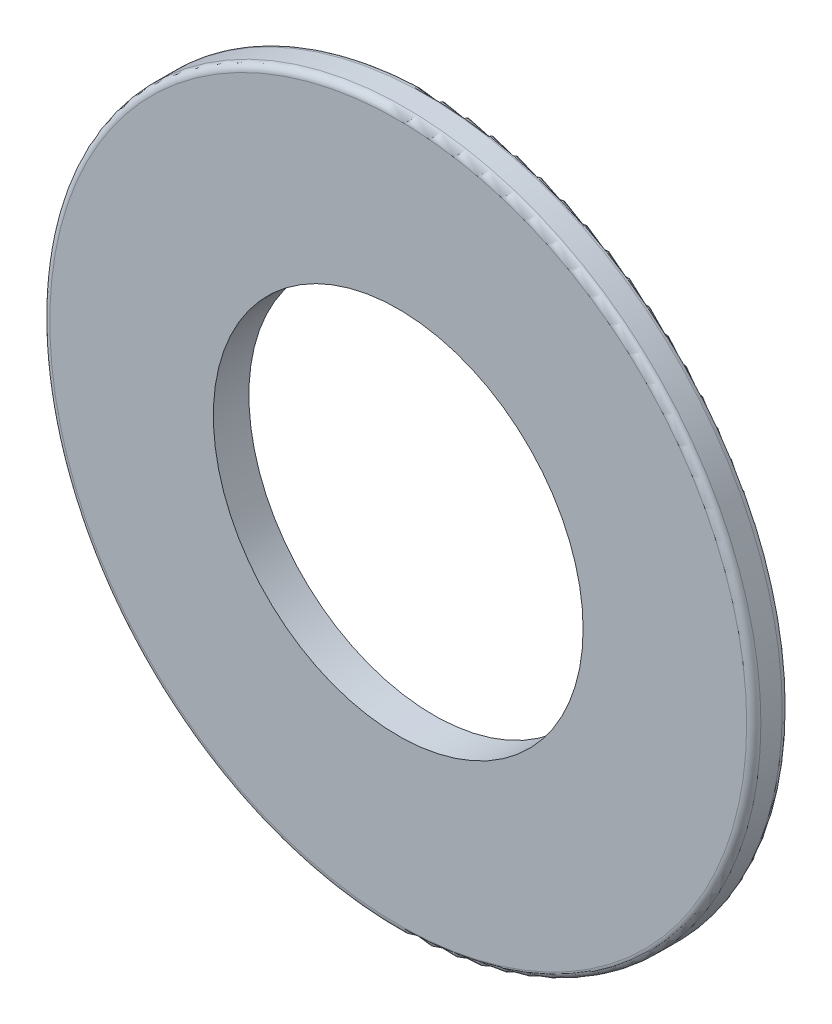
ISO-10303-21;
HEADER;
FILE_DESCRIPTION(('STEP AP214'),'2;1');
FILE_NAME('part.step','',(''),(''),'','','');
FILE_SCHEMA(('AUTOMOTIVE_DESIGN { 1 0 10303 214 1 1 1 1 }'));
ENDSEC;
DATA;
#1=APPLICATION_CONTEXT('core data for automotive mechanical design processes');
#2=APPLICATION_PROTOCOL_DEFINITION('international standard','automotive_design',2000,#1);
#3=PRODUCT_CONTEXT('',#1,'mechanical');
#4=PRODUCT('Part','Part','',(#3));
#5=PRODUCT_RELATED_PRODUCT_CATEGORY('part','',(#4));
#6=PRODUCT_DEFINITION_FORMATION('','',#4);
#7=PRODUCT_DEFINITION_CONTEXT('part definition',#1,'design');
#8=PRODUCT_DEFINITION('design','',#6,#7);
#9=PRODUCT_DEFINITION_SHAPE('','',#8);
#10=(LENGTH_UNIT() NAMED_UNIT(*) SI_UNIT(.MILLI.,.METRE.));
#11=(NAMED_UNIT(*) PLANE_ANGLE_UNIT() SI_UNIT($,.RADIAN.));
#12=(NAMED_UNIT(*) SI_UNIT($,.STERADIAN.) SOLID_ANGLE_UNIT());
#13=UNCERTAINTY_MEASURE_WITH_UNIT(LENGTH_MEASURE(1.E-05),#10,'distance_accuracy_value','');
#14=(GEOMETRIC_REPRESENTATION_CONTEXT(3) GLOBAL_UNCERTAINTY_ASSIGNED_CONTEXT((#13)) GLOBAL_UNIT_ASSIGNED_CONTEXT((#10,
#11,#12)) REPRESENTATION_CONTEXT('',''));
#15=CARTESIAN_POINT('',(0.,0.,0.));
#16=DIRECTION('',(0.,0.,1.));
#17=DIRECTION('',(1.,0.,0.));
#18=AXIS2_PLACEMENT_3D('',#15,#16,#17);
#19=CARTESIAN_POINT('',(0.,0.,0.5));
#20=DIRECTION('',(0.,0.,1.));
#21=DIRECTION('',(1.,0.,0.));
#22=AXIS2_PLACEMENT_3D('',#19,#20,#21);
#23=PLANE('',#22);
#24=CARTESIAN_POINT('',(0.,0.,0.5));
#25=DIRECTION('',(0.,0.,1.));
#26=DIRECTION('',(1.,0.,0.));
#27=AXIS2_PLACEMENT_3D('',#24,#25,#26);
#28=CIRCLE('',#27,4.9);
#29=CARTESIAN_POINT('',(4.9,0.,0.5));
#30=VERTEX_POINT('',#29);
#31=EDGE_CURVE('E10',#30,#30,#28,.T.);
#32=ORIENTED_EDGE('',*,*,#31,.T.);
#33=EDGE_LOOP('',(#32));
#34=FACE_BOUND('',#33,.T.);
#35=CARTESIAN_POINT('',(0.,0.,0.5));
#36=DIRECTION('',(0.,0.,1.));
#37=DIRECTION('',(1.,0.,0.));
#38=AXIS2_PLACEMENT_3D('',#35,#36,#37);
#39=CIRCLE('',#38,2.6);
#40=CARTESIAN_POINT('',(2.6,0.,0.5));
#41=VERTEX_POINT('',#40);
#42=EDGE_CURVE('E65',#41,#41,#39,.T.);
#43=ORIENTED_EDGE('',*,*,#42,.F.);
#44=EDGE_LOOP('',(#43));
#45=FACE_BOUND('',#44,.T.);
#46=ADVANCED_FACE('F41',(#34,#45),#23,.T.);
#47=CARTESIAN_POINT('',(0.,0.,0.));
#48=DIRECTION('',(0.,0.,1.));
#49=DIRECTION('',(1.,0.,0.));
#50=AXIS2_PLACEMENT_3D('',#47,#48,#49);
#51=PLANE('',#50);
#52=CARTESIAN_POINT('',(0.,0.,0.));
#53=DIRECTION('',(0.,0.,1.));
#54=DIRECTION('',(1.,0.,0.));
#55=AXIS2_PLACEMENT_3D('',#52,#53,#54);
#56=CIRCLE('',#55,4.9);
#57=CARTESIAN_POINT('',(4.9,0.,0.));
#58=VERTEX_POINT('',#57);
#59=EDGE_CURVE('E49',#58,#58,#56,.F.);
#60=ORIENTED_EDGE('',*,*,#59,.T.);
#61=EDGE_LOOP('',(#60));
#62=FACE_BOUND('',#61,.T.);
#63=CARTESIAN_POINT('',(0.,0.,0.));
#64=DIRECTION('',(0.,0.,1.));
#65=DIRECTION('',(1.,0.,0.));
#66=AXIS2_PLACEMENT_3D('',#63,#64,#65);
#67=CIRCLE('',#66,2.6);
#68=CARTESIAN_POINT('',(2.6,0.,0.));
#69=VERTEX_POINT('',#68);
#70=EDGE_CURVE('E66',#69,#69,#67,.T.);
#71=ORIENTED_EDGE('',*,*,#70,.T.);
#72=EDGE_LOOP('',(#71));
#73=FACE_BOUND('',#72,.T.);
#74=ADVANCED_FACE('F78',(#62,#73),#51,.F.);
#75=CARTESIAN_POINT('',(0.,0.,0.5));
#76=DIRECTION('',(0.,0.,-1.));
#77=DIRECTION('',(-1.,0.,0.));
#78=AXIS2_PLACEMENT_3D('',#75,#76,#77);
#79=CYLINDRICAL_SURFACE('',#78,5.);
#80=CARTESIAN_POINT('',(0.,0.,0.1));
#81=DIRECTION('',(0.,0.,1.));
#82=DIRECTION('',(1.,0.,0.));
#83=AXIS2_PLACEMENT_3D('',#80,#81,#82);
#84=CIRCLE('',#83,5.);
#85=CARTESIAN_POINT('',(5.,0.,0.1));
#86=VERTEX_POINT('',#85);
#87=EDGE_CURVE('E54',#86,#86,#84,.T.);
#88=ORIENTED_EDGE('',*,*,#87,.T.);
#89=EDGE_LOOP('',(#88));
#90=FACE_BOUND('',#89,.T.);
#91=CARTESIAN_POINT('',(0.,0.,0.4));
#92=DIRECTION('',(0.,0.,1.));
#93=DIRECTION('',(1.,0.,0.));
#94=AXIS2_PLACEMENT_3D('',#91,#92,#93);
#95=CIRCLE('',#94,5.);
#96=CARTESIAN_POINT('',(5.,0.,0.4));
#97=VERTEX_POINT('',#96);
#98=EDGE_CURVE('E59',#97,#97,#95,.F.);
#99=ORIENTED_EDGE('',*,*,#98,.T.);
#100=EDGE_LOOP('',(#99));
#101=FACE_BOUND('',#100,.T.);
#102=ADVANCED_FACE('F83',(#90,#101),#79,.T.);
#103=CARTESIAN_POINT('',(0.,0.,0.5));
#104=DIRECTION('',(0.,0.,-1.));
#105=DIRECTION('',(-1.,0.,0.));
#106=AXIS2_PLACEMENT_3D('',#103,#104,#105);
#107=CYLINDRICAL_SURFACE('',#106,2.6);
#108=ORIENTED_EDGE('',*,*,#42,.T.);
#109=EDGE_LOOP('',(#108));
#110=FACE_BOUND('',#109,.T.);
#111=ORIENTED_EDGE('',*,*,#70,.F.);
#112=EDGE_LOOP('',(#111));
#113=FACE_BOUND('',#112,.T.);
#114=ADVANCED_FACE('F74',(#110,#113),#107,.F.);
#115=CARTESIAN_POINT('',(0.,0.,0.1));
#116=DIRECTION('',(0.,0.,1.));
#117=DIRECTION('',(1.,0.,0.));
#118=AXIS2_PLACEMENT_3D('',#115,#116,#117);
#119=TOROIDAL_SURFACE('',#118,4.9,0.1);
#120=ORIENTED_EDGE('',*,*,#59,.F.);
#121=EDGE_LOOP('',(#120));
#122=FACE_BOUND('',#121,.T.);
#123=ORIENTED_EDGE('',*,*,#87,.F.);
#124=EDGE_LOOP('',(#123));
#125=FACE_BOUND('',#124,.T.);
#126=ADVANCED_FACE('F89',(#122,#125),#119,.T.);
#127=CARTESIAN_POINT('',(0.,0.,0.4));
#128=DIRECTION('',(0.,0.,1.));
#129=DIRECTION('',(1.,0.,0.));
#130=AXIS2_PLACEMENT_3D('',#127,#128,#129);
#131=TOROIDAL_SURFACE('',#130,4.9,0.1);
#132=ORIENTED_EDGE('',*,*,#98,.F.);
#133=EDGE_LOOP('',(#132));
#134=FACE_BOUND('',#133,.T.);
#135=ORIENTED_EDGE('',*,*,#31,.F.);
#136=EDGE_LOOP('',(#135));
#137=FACE_BOUND('',#136,.T.);
#138=ADVANCED_FACE('F43',(#134,#137),#131,.T.);
#139=CLOSED_SHELL('',(#46,#74,#102,#114,#126,#138));
#140=MANIFOLD_SOLID_BREP('B2',#139);
#141=ADVANCED_BREP_SHAPE_REPRESENTATION('',(#18,#140),#14);
#142=SHAPE_DEFINITION_REPRESENTATION(#9,#141);
ENDSEC;
END-ISO-10303-21;
